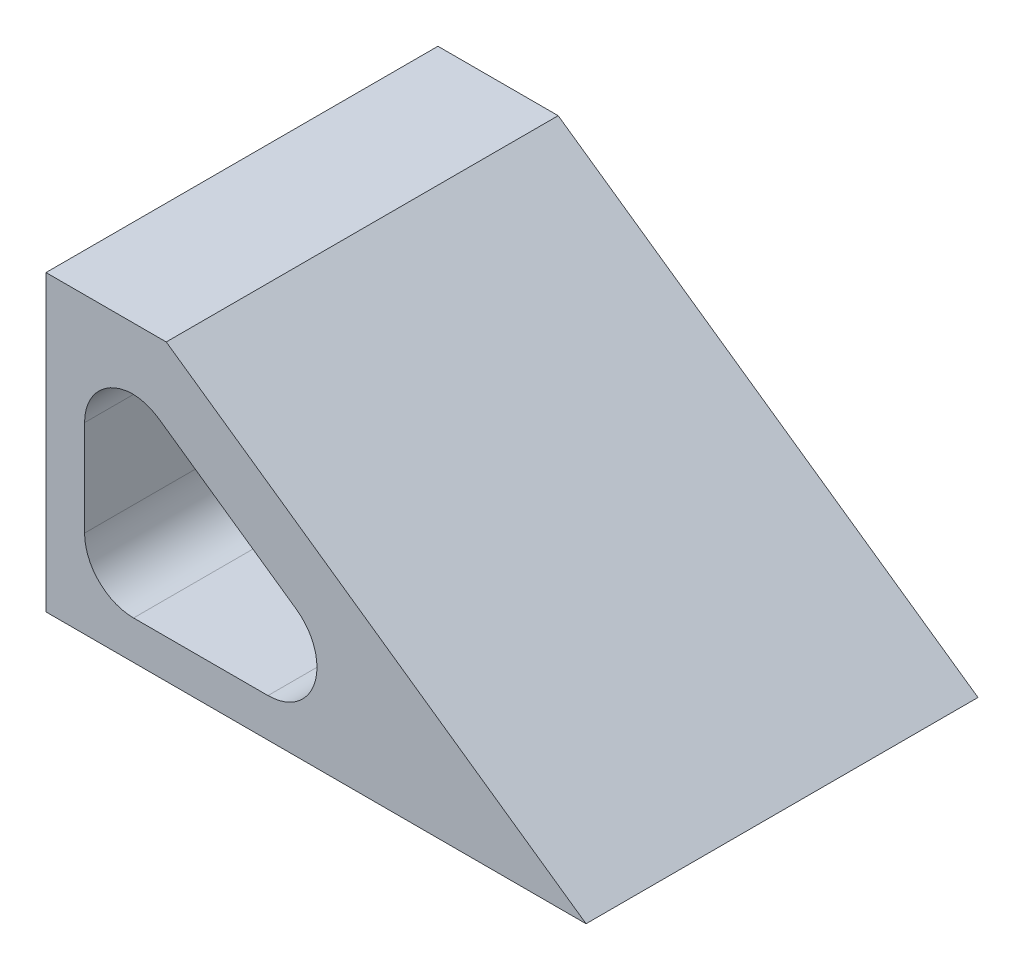
ISO-10303-21;
HEADER;
FILE_DESCRIPTION(('STEP AP214'),'2;1');
FILE_NAME('part.step','',(''),(''),'','','');
FILE_SCHEMA(('AUTOMOTIVE_DESIGN { 1 0 10303 214 1 1 1 1 }'));
ENDSEC;
DATA;
#1=APPLICATION_CONTEXT('core data for automotive mechanical design processes');
#2=APPLICATION_PROTOCOL_DEFINITION('international standard','automotive_design',2000,#1);
#3=PRODUCT_CONTEXT('',#1,'mechanical');
#4=PRODUCT('Part','Part','',(#3));
#5=PRODUCT_RELATED_PRODUCT_CATEGORY('part','',(#4));
#6=PRODUCT_DEFINITION_FORMATION('','',#4);
#7=PRODUCT_DEFINITION_CONTEXT('part definition',#1,'design');
#8=PRODUCT_DEFINITION('design','',#6,#7);
#9=PRODUCT_DEFINITION_SHAPE('','',#8);
#10=(LENGTH_UNIT() NAMED_UNIT(*) SI_UNIT(.MILLI.,.METRE.));
#11=(NAMED_UNIT(*) PLANE_ANGLE_UNIT() SI_UNIT($,.RADIAN.));
#12=(NAMED_UNIT(*) SI_UNIT($,.STERADIAN.) SOLID_ANGLE_UNIT());
#13=UNCERTAINTY_MEASURE_WITH_UNIT(LENGTH_MEASURE(1.E-05),#10,'distance_accuracy_value','');
#14=(GEOMETRIC_REPRESENTATION_CONTEXT(3) GLOBAL_UNCERTAINTY_ASSIGNED_CONTEXT((#13)) GLOBAL_UNIT_ASSIGNED_CONTEXT((#10,
#11,#12)) REPRESENTATION_CONTEXT('',''));
#15=CARTESIAN_POINT('',(0.,0.,0.));
#16=DIRECTION('',(0.,0.,1.));
#17=DIRECTION('',(1.,0.,0.));
#18=AXIS2_PLACEMENT_3D('',#15,#16,#17);
#19=CARTESIAN_POINT('',(70.,38.1,-25.4));
#20=DIRECTION('',(0.,0.,1.));
#21=DIRECTION('',(1.,0.,0.));
#22=AXIS2_PLACEMENT_3D('',#19,#20,#21);
#23=PLANE('',#22);
#24=CARTESIAN_POINT('',(11.35,23.75,-25.4));
#25=DIRECTION('',(0.,0.,1.));
#26=DIRECTION('',(1.,0.,0.));
#27=AXIS2_PLACEMENT_3D('',#24,#25,#26);
#28=CIRCLE('',#27,6.35);
#29=CARTESIAN_POINT('',(5.,23.75,-25.4));
#30=VERTEX_POINT('',#29);
#31=CARTESIAN_POINT('',(11.2065116613562,30.0983786195117,-25.4));
#32=VERTEX_POINT('',#31);
#33=EDGE_CURVE('E124',#30,#32,#28,.F.);
#34=ORIENTED_EDGE('',*,*,#33,.F.);
#35=DIRECTION('',(0.,-1.,0.));
#36=VECTOR('',#35,1.);
#37=CARTESIAN_POINT('',(5.,0.,-25.4));
#38=LINE('',#37,#36);
#39=CARTESIAN_POINT('',(5.,11.35,-25.4));
#40=VERTEX_POINT('',#39);
#41=EDGE_CURVE('E118',#30,#40,#38,.T.);
#42=ORIENTED_EDGE('',*,*,#41,.T.);
#43=CARTESIAN_POINT('',(11.35,11.35,-25.4));
#44=DIRECTION('',(0.,0.,1.));
#45=DIRECTION('',(1.,0.,0.));
#46=AXIS2_PLACEMENT_3D('',#43,#44,#45);
#47=CIRCLE('',#46,6.35);
#48=CARTESIAN_POINT('',(11.35,5.,-25.4));
#49=VERTEX_POINT('',#48);
#50=EDGE_CURVE('E127',#40,#49,#47,.T.);
#51=ORIENTED_EDGE('',*,*,#50,.T.);
#52=DIRECTION('',(1.,0.,0.));
#53=VECTOR('',#52,1.);
#54=CARTESIAN_POINT('',(0.,5.,-25.4));
#55=LINE('',#54,#53);
#56=CARTESIAN_POINT('',(28.7720586063146,5.,-25.4));
#57=VERTEX_POINT('',#56);
#58=EDGE_CURVE('E48',#49,#57,#55,.T.);
#59=ORIENTED_EDGE('',*,*,#58,.T.);
#60=CARTESIAN_POINT('',(28.7720586063146,11.35,-25.4));
#61=DIRECTION('',(0.,0.,1.));
#62=DIRECTION('',(1.,0.,0.));
#63=AXIS2_PLACEMENT_3D('',#60,#61,#62);
#64=CIRCLE('',#63,6.35);
#65=CARTESIAN_POINT('',(32.4142689771438,16.5516154812351,-25.4));
#66=VERTEX_POINT('',#65);
#67=EDGE_CURVE('E140',#57,#66,#64,.T.);
#68=ORIENTED_EDGE('',*,*,#67,.T.);
#69=DIRECTION('',(-0.819152044288989,0.57357643635105,0.));
#70=VECTOR('',#69,1.);
#71=CARTESIAN_POINT('',(18.4406834927935,26.336025373195,-25.4));
#72=LINE('',#71,#70);
#73=CARTESIAN_POINT('',(14.7052336935417,28.9516154812351,-25.4));
#74=VERTEX_POINT('',#73);
#75=EDGE_CURVE('E143',#66,#74,#72,.T.);
#76=ORIENTED_EDGE('',*,*,#75,.T.);
#77=CARTESIAN_POINT('',(11.0630233227126,23.75,-25.4));
#78=DIRECTION('',(0.,0.,1.));
#79=DIRECTION('',(1.,0.,0.));
#80=AXIS2_PLACEMENT_3D('',#77,#78,#79);
#81=CIRCLE('',#80,6.35);
#82=EDGE_CURVE('E146',#74,#32,#81,.T.);
#83=ORIENTED_EDGE('',*,*,#82,.T.);
#84=EDGE_LOOP('',(#34,#42,#51,#59,#68,#76,#83));
#85=FACE_BOUND('',#84,.T.);
#86=DIRECTION('',(-1.,0.,0.));
#87=VECTOR('',#86,1.);
#88=CARTESIAN_POINT('',(70.,38.1,-25.4));
#89=LINE('',#88,#87);
#90=CARTESIAN_POINT('',(15.587560943126,38.1,-25.4));
#91=VERTEX_POINT('',#90);
#92=CARTESIAN_POINT('',(0.,38.1,-25.4));
#93=VERTEX_POINT('',#92);
#94=EDGE_CURVE('E182',#91,#93,#89,.T.);
#95=ORIENTED_EDGE('',*,*,#94,.F.);
#96=DIRECTION('',(0.819152044288989,-0.57357643635105,0.));
#97=VECTOR('',#96,1.);
#98=CARTESIAN_POINT('',(70.,0.,-25.4));
#99=LINE('',#98,#97);
#100=CARTESIAN_POINT('',(70.,0.,-25.4));
#101=VERTEX_POINT('',#100);
#102=EDGE_CURVE('E175',#91,#101,#99,.T.);
#103=ORIENTED_EDGE('',*,*,#102,.T.);
#104=DIRECTION('',(-1.,0.,0.));
#105=VECTOR('',#104,1.);
#106=CARTESIAN_POINT('',(70.,0.,-25.4));
#107=LINE('',#106,#105);
#108=CARTESIAN_POINT('',(0.,0.,-25.4));
#109=VERTEX_POINT('',#108);
#110=EDGE_CURVE('E181',#101,#109,#107,.T.);
#111=ORIENTED_EDGE('',*,*,#110,.T.);
#112=DIRECTION('',(0.,-1.,0.));
#113=VECTOR('',#112,1.);
#114=CARTESIAN_POINT('',(0.,38.1,-25.4));
#115=LINE('',#114,#113);
#116=EDGE_CURVE('E11',#93,#109,#115,.T.);
#117=ORIENTED_EDGE('',*,*,#116,.F.);
#118=EDGE_LOOP('',(#95,#103,#111,#117));
#119=FACE_BOUND('',#118,.T.);
#120=ADVANCED_FACE('F34',(#85,#119),#23,.F.);
#121=CARTESIAN_POINT('',(0.,38.1,-25.4));
#122=DIRECTION('',(1.,0.,0.));
#123=DIRECTION('',(0.,0.,-1.));
#124=AXIS2_PLACEMENT_3D('',#121,#122,#123);
#125=PLANE('',#124);
#126=DIRECTION('',(0.,0.,1.));
#127=VECTOR('',#126,1.);
#128=CARTESIAN_POINT('',(0.,0.,-25.4));
#129=LINE('',#128,#127);
#130=CARTESIAN_POINT('',(0.,0.,25.4));
#131=VERTEX_POINT('',#130);
#132=EDGE_CURVE('E192',#109,#131,#129,.T.);
#133=ORIENTED_EDGE('',*,*,#132,.T.);
#134=DIRECTION('',(0.,-1.,0.));
#135=VECTOR('',#134,1.);
#136=CARTESIAN_POINT('',(0.,38.1,25.4));
#137=LINE('',#136,#135);
#138=CARTESIAN_POINT('',(0.,38.1,25.4));
#139=VERTEX_POINT('',#138);
#140=EDGE_CURVE('E41',#139,#131,#137,.T.);
#141=ORIENTED_EDGE('',*,*,#140,.F.);
#142=DIRECTION('',(0.,0.,1.));
#143=VECTOR('',#142,1.);
#144=CARTESIAN_POINT('',(0.,38.1,-25.4));
#145=LINE('',#144,#143);
#146=EDGE_CURVE('E184',#93,#139,#145,.T.);
#147=ORIENTED_EDGE('',*,*,#146,.F.);
#148=ORIENTED_EDGE('',*,*,#116,.T.);
#149=EDGE_LOOP('',(#133,#141,#147,#148));
#150=FACE_BOUND('',#149,.T.);
#151=ADVANCED_FACE('F217',(#150),#125,.F.);
#152=CARTESIAN_POINT('',(0.,38.1,25.4));
#153=DIRECTION('',(0.,0.,-1.));
#154=DIRECTION('',(-1.,0.,0.));
#155=AXIS2_PLACEMENT_3D('',#152,#153,#154);
#156=PLANE('',#155);
#157=CARTESIAN_POINT('',(11.35,11.35,25.4));
#158=DIRECTION('',(0.,0.,1.));
#159=DIRECTION('',(1.,0.,0.));
#160=AXIS2_PLACEMENT_3D('',#157,#158,#159);
#161=CIRCLE('',#160,6.35);
#162=CARTESIAN_POINT('',(5.,11.35,25.4));
#163=VERTEX_POINT('',#162);
#164=CARTESIAN_POINT('',(11.35,5.,25.4));
#165=VERTEX_POINT('',#164);
#166=EDGE_CURVE('E150',#163,#165,#161,.T.);
#167=ORIENTED_EDGE('',*,*,#166,.F.);
#168=DIRECTION('',(0.,-1.,0.));
#169=VECTOR('',#168,1.);
#170=CARTESIAN_POINT('',(5.,0.,25.4));
#171=LINE('',#170,#169);
#172=CARTESIAN_POINT('',(5.,23.75,25.4));
#173=VERTEX_POINT('',#172);
#174=EDGE_CURVE('E56',#173,#163,#171,.T.);
#175=ORIENTED_EDGE('',*,*,#174,.F.);
#176=CARTESIAN_POINT('',(11.35,23.75,25.4));
#177=DIRECTION('',(0.,0.,1.));
#178=DIRECTION('',(1.,0.,0.));
#179=AXIS2_PLACEMENT_3D('',#176,#177,#178);
#180=CIRCLE('',#179,6.35);
#181=CARTESIAN_POINT('',(11.2065116613562,30.0983786195117,25.4));
#182=VERTEX_POINT('',#181);
#183=EDGE_CURVE('E133',#173,#182,#180,.F.);
#184=ORIENTED_EDGE('',*,*,#183,.T.);
#185=CARTESIAN_POINT('',(11.0630233227126,23.75,25.4));
#186=DIRECTION('',(0.,0.,1.));
#187=DIRECTION('',(1.,0.,0.));
#188=AXIS2_PLACEMENT_3D('',#185,#186,#187);
#189=CIRCLE('',#188,6.35);
#190=CARTESIAN_POINT('',(14.7052336935417,28.9516154812351,25.4));
#191=VERTEX_POINT('',#190);
#192=EDGE_CURVE('E136',#191,#182,#189,.T.);
#193=ORIENTED_EDGE('',*,*,#192,.F.);
#194=DIRECTION('',(-0.819152044288989,0.57357643635105,0.));
#195=VECTOR('',#194,1.);
#196=CARTESIAN_POINT('',(18.4406834927935,26.336025373195,25.4));
#197=LINE('',#196,#195);
#198=CARTESIAN_POINT('',(32.4142689771438,16.5516154812351,25.4));
#199=VERTEX_POINT('',#198);
#200=EDGE_CURVE('E158',#199,#191,#197,.T.);
#201=ORIENTED_EDGE('',*,*,#200,.F.);
#202=CARTESIAN_POINT('',(28.7720586063146,11.35,25.4));
#203=DIRECTION('',(0.,0.,1.));
#204=DIRECTION('',(1.,0.,0.));
#205=AXIS2_PLACEMENT_3D('',#202,#203,#204);
#206=CIRCLE('',#205,6.35);
#207=CARTESIAN_POINT('',(28.7720586063146,5.,25.4));
#208=VERTEX_POINT('',#207);
#209=EDGE_CURVE('E155',#208,#199,#206,.T.);
#210=ORIENTED_EDGE('',*,*,#209,.F.);
#211=DIRECTION('',(1.,0.,0.));
#212=VECTOR('',#211,1.);
#213=CARTESIAN_POINT('',(0.,5.,25.4));
#214=LINE('',#213,#212);
#215=EDGE_CURVE('E152',#165,#208,#214,.T.);
#216=ORIENTED_EDGE('',*,*,#215,.F.);
#217=EDGE_LOOP('',(#167,#175,#184,#193,#201,#210,#216));
#218=FACE_BOUND('',#217,.T.);
#219=DIRECTION('',(1.,0.,0.));
#220=VECTOR('',#219,1.);
#221=CARTESIAN_POINT('',(0.,0.,25.4));
#222=LINE('',#221,#220);
#223=CARTESIAN_POINT('',(70.,0.,25.4));
#224=VERTEX_POINT('',#223);
#225=EDGE_CURVE('E194',#131,#224,#222,.T.);
#226=ORIENTED_EDGE('',*,*,#225,.T.);
#227=DIRECTION('',(0.819152044288989,-0.57357643635105,0.));
#228=VECTOR('',#227,1.);
#229=CARTESIAN_POINT('',(70.,0.,25.4));
#230=LINE('',#229,#228);
#231=CARTESIAN_POINT('',(15.587560943126,38.1,25.4));
#232=VERTEX_POINT('',#231);
#233=EDGE_CURVE('E165',#232,#224,#230,.T.);
#234=ORIENTED_EDGE('',*,*,#233,.F.);
#235=DIRECTION('',(1.,0.,0.));
#236=VECTOR('',#235,1.);
#237=CARTESIAN_POINT('',(0.,38.1,25.4));
#238=LINE('',#237,#236);
#239=EDGE_CURVE('E187',#139,#232,#238,.T.);
#240=ORIENTED_EDGE('',*,*,#239,.F.);
#241=ORIENTED_EDGE('',*,*,#140,.T.);
#242=EDGE_LOOP('',(#226,#234,#240,#241));
#243=FACE_BOUND('',#242,.T.);
#244=ADVANCED_FACE('F202',(#218,#243),#156,.F.);
#245=CARTESIAN_POINT('',(0.,38.1,0.));
#246=DIRECTION('',(0.,1.,0.));
#247=DIRECTION('',(0.,0.,1.));
#248=AXIS2_PLACEMENT_3D('',#245,#246,#247);
#249=PLANE('',#248);
#250=DIRECTION('',(0.,0.,1.));
#251=VECTOR('',#250,1.);
#252=CARTESIAN_POINT('',(15.587560943126,38.1,-25.4));
#253=LINE('',#252,#251);
#254=EDGE_CURVE('E178',#91,#232,#253,.T.);
#255=ORIENTED_EDGE('',*,*,#254,.F.);
#256=ORIENTED_EDGE('',*,*,#94,.T.);
#257=ORIENTED_EDGE('',*,*,#146,.T.);
#258=ORIENTED_EDGE('',*,*,#239,.T.);
#259=EDGE_LOOP('',(#255,#256,#257,#258));
#260=FACE_BOUND('',#259,.T.);
#261=ADVANCED_FACE('F216',(#260),#249,.T.);
#262=CARTESIAN_POINT('',(0.,0.,0.));
#263=DIRECTION('',(0.,1.,0.));
#264=DIRECTION('',(0.,0.,1.));
#265=AXIS2_PLACEMENT_3D('',#262,#263,#264);
#266=PLANE('',#265);
#267=ORIENTED_EDGE('',*,*,#110,.F.);
#268=DIRECTION('',(0.,0.,-1.));
#269=VECTOR('',#268,1.);
#270=CARTESIAN_POINT('',(70.,0.,25.4));
#271=LINE('',#270,#269);
#272=EDGE_CURVE('E185',#224,#101,#271,.T.);
#273=ORIENTED_EDGE('',*,*,#272,.F.);
#274=ORIENTED_EDGE('',*,*,#225,.F.);
#275=ORIENTED_EDGE('',*,*,#132,.F.);
#276=EDGE_LOOP('',(#267,#273,#274,#275));
#277=FACE_BOUND('',#276,.T.);
#278=ADVANCED_FACE('F209',(#277),#266,.F.);
#279=CARTESIAN_POINT('',(70.,0.,-25.4));
#280=DIRECTION('',(-0.57357643635105,-0.819152044288989,0.));
#281=DIRECTION('',(0.819152044288989,-0.57357643635105,0.));
#282=AXIS2_PLACEMENT_3D('',#279,#280,#281);
#283=PLANE('',#282);
#284=ORIENTED_EDGE('',*,*,#233,.T.);
#285=ORIENTED_EDGE('',*,*,#272,.T.);
#286=ORIENTED_EDGE('',*,*,#102,.F.);
#287=ORIENTED_EDGE('',*,*,#254,.T.);
#288=EDGE_LOOP('',(#284,#285,#286,#287));
#289=FACE_BOUND('',#288,.T.);
#290=ADVANCED_FACE('F211',(#289),#283,.F.);
#291=CARTESIAN_POINT('',(5.,0.,-25.4));
#292=DIRECTION('',(-1.,0.,0.));
#293=DIRECTION('',(0.,-1.,0.));
#294=AXIS2_PLACEMENT_3D('',#291,#292,#293);
#295=PLANE('',#294);
#296=ORIENTED_EDGE('',*,*,#174,.T.);
#297=DIRECTION('',(0.,0.,1.));
#298=VECTOR('',#297,1.);
#299=CARTESIAN_POINT('',(5.,11.35,-25.4));
#300=LINE('',#299,#298);
#301=EDGE_CURVE('E114',#40,#163,#300,.T.);
#302=ORIENTED_EDGE('',*,*,#301,.F.);
#303=ORIENTED_EDGE('',*,*,#41,.F.);
#304=DIRECTION('',(0.,0.,1.));
#305=VECTOR('',#304,1.);
#306=CARTESIAN_POINT('',(5.,23.75,-25.4));
#307=LINE('',#306,#305);
#308=EDGE_CURVE('E163',#30,#173,#307,.T.);
#309=ORIENTED_EDGE('',*,*,#308,.T.);
#310=EDGE_LOOP('',(#296,#302,#303,#309));
#311=FACE_BOUND('',#310,.T.);
#312=ADVANCED_FACE('F116',(#311),#295,.F.);
#313=CARTESIAN_POINT('',(11.35,23.75,-25.4));
#314=DIRECTION('',(0.,0.,1.));
#315=DIRECTION('',(1.,0.,0.));
#316=AXIS2_PLACEMENT_3D('',#313,#314,#315);
#317=CYLINDRICAL_SURFACE('',#316,6.35);
#318=ORIENTED_EDGE('',*,*,#183,.F.);
#319=ORIENTED_EDGE('',*,*,#308,.F.);
#320=ORIENTED_EDGE('',*,*,#33,.T.);
#321=DIRECTION('',(0.,0.,1.));
#322=VECTOR('',#321,1.);
#323=CARTESIAN_POINT('',(11.2065116613562,30.0983786195117,-25.4));
#324=LINE('',#323,#322);
#325=EDGE_CURVE('E166',#32,#182,#324,.T.);
#326=ORIENTED_EDGE('',*,*,#325,.T.);
#327=EDGE_LOOP('',(#318,#319,#320,#326));
#328=FACE_BOUND('',#327,.T.);
#329=ADVANCED_FACE('F234',(#328),#317,.F.);
#330=CARTESIAN_POINT('',(11.0630233227126,23.75,-25.4));
#331=DIRECTION('',(0.,0.,1.));
#332=DIRECTION('',(1.,0.,0.));
#333=AXIS2_PLACEMENT_3D('',#330,#331,#332);
#334=CYLINDRICAL_SURFACE('',#333,6.35);
#335=ORIENTED_EDGE('',*,*,#192,.T.);
#336=ORIENTED_EDGE('',*,*,#325,.F.);
#337=ORIENTED_EDGE('',*,*,#82,.F.);
#338=DIRECTION('',(0.,0.,1.));
#339=VECTOR('',#338,1.);
#340=CARTESIAN_POINT('',(14.7052336935417,28.9516154812351,-25.4));
#341=LINE('',#340,#339);
#342=EDGE_CURVE('E168',#74,#191,#341,.T.);
#343=ORIENTED_EDGE('',*,*,#342,.T.);
#344=EDGE_LOOP('',(#335,#336,#337,#343));
#345=FACE_BOUND('',#344,.T.);
#346=ADVANCED_FACE('F247',(#345),#334,.F.);
#347=CARTESIAN_POINT('',(18.4406834927935,26.336025373195,-25.4));
#348=DIRECTION('',(0.57357643635105,0.819152044288989,0.));
#349=DIRECTION('',(-0.819152044288989,0.57357643635105,0.));
#350=AXIS2_PLACEMENT_3D('',#347,#348,#349);
#351=PLANE('',#350);
#352=ORIENTED_EDGE('',*,*,#200,.T.);
#353=ORIENTED_EDGE('',*,*,#342,.F.);
#354=ORIENTED_EDGE('',*,*,#75,.F.);
#355=DIRECTION('',(0.,0.,1.));
#356=VECTOR('',#355,1.);
#357=CARTESIAN_POINT('',(32.4142689771438,16.5516154812351,-25.4));
#358=LINE('',#357,#356);
#359=EDGE_CURVE('E170',#66,#199,#358,.T.);
#360=ORIENTED_EDGE('',*,*,#359,.T.);
#361=EDGE_LOOP('',(#352,#353,#354,#360));
#362=FACE_BOUND('',#361,.T.);
#363=ADVANCED_FACE('F243',(#362),#351,.F.);
#364=CARTESIAN_POINT('',(28.7720586063146,11.35,-25.4));
#365=DIRECTION('',(0.,0.,1.));
#366=DIRECTION('',(1.,0.,0.));
#367=AXIS2_PLACEMENT_3D('',#364,#365,#366);
#368=CYLINDRICAL_SURFACE('',#367,6.35);
#369=ORIENTED_EDGE('',*,*,#209,.T.);
#370=ORIENTED_EDGE('',*,*,#359,.F.);
#371=ORIENTED_EDGE('',*,*,#67,.F.);
#372=DIRECTION('',(0.,0.,1.));
#373=VECTOR('',#372,1.);
#374=CARTESIAN_POINT('',(28.7720586063146,5.,-25.4));
#375=LINE('',#374,#373);
#376=EDGE_CURVE('E172',#57,#208,#375,.T.);
#377=ORIENTED_EDGE('',*,*,#376,.T.);
#378=EDGE_LOOP('',(#369,#370,#371,#377));
#379=FACE_BOUND('',#378,.T.);
#380=ADVANCED_FACE('F240',(#379),#368,.F.);
#381=CARTESIAN_POINT('',(0.,5.,-25.4));
#382=DIRECTION('',(0.,-1.,0.));
#383=DIRECTION('',(1.,0.,0.));
#384=AXIS2_PLACEMENT_3D('',#381,#382,#383);
#385=PLANE('',#384);
#386=ORIENTED_EDGE('',*,*,#215,.T.);
#387=ORIENTED_EDGE('',*,*,#376,.F.);
#388=ORIENTED_EDGE('',*,*,#58,.F.);
#389=DIRECTION('',(0.,0.,1.));
#390=VECTOR('',#389,1.);
#391=CARTESIAN_POINT('',(11.35,5.,-25.4));
#392=LINE('',#391,#390);
#393=EDGE_CURVE('E123',#49,#165,#392,.T.);
#394=ORIENTED_EDGE('',*,*,#393,.T.);
#395=EDGE_LOOP('',(#386,#387,#388,#394));
#396=FACE_BOUND('',#395,.T.);
#397=ADVANCED_FACE('F237',(#396),#385,.F.);
#398=CARTESIAN_POINT('',(11.35,11.35,-25.4));
#399=DIRECTION('',(0.,0.,1.));
#400=DIRECTION('',(1.,0.,0.));
#401=AXIS2_PLACEMENT_3D('',#398,#399,#400);
#402=CYLINDRICAL_SURFACE('',#401,6.35);
#403=ORIENTED_EDGE('',*,*,#166,.T.);
#404=ORIENTED_EDGE('',*,*,#393,.F.);
#405=ORIENTED_EDGE('',*,*,#50,.F.);
#406=ORIENTED_EDGE('',*,*,#301,.T.);
#407=EDGE_LOOP('',(#403,#404,#405,#406));
#408=FACE_BOUND('',#407,.T.);
#409=ADVANCED_FACE('F128',(#408),#402,.F.);
#410=CLOSED_SHELL('',(#120,#151,#244,#261,#278,#290,#312,#329,#346,#363,#380,#397,#409));
#411=MANIFOLD_SOLID_BREP('B2',#410);
#412=ADVANCED_BREP_SHAPE_REPRESENTATION('',(#18,#411),#14);
#413=SHAPE_DEFINITION_REPRESENTATION(#9,#412);
ENDSEC;
END-ISO-10303-21;
